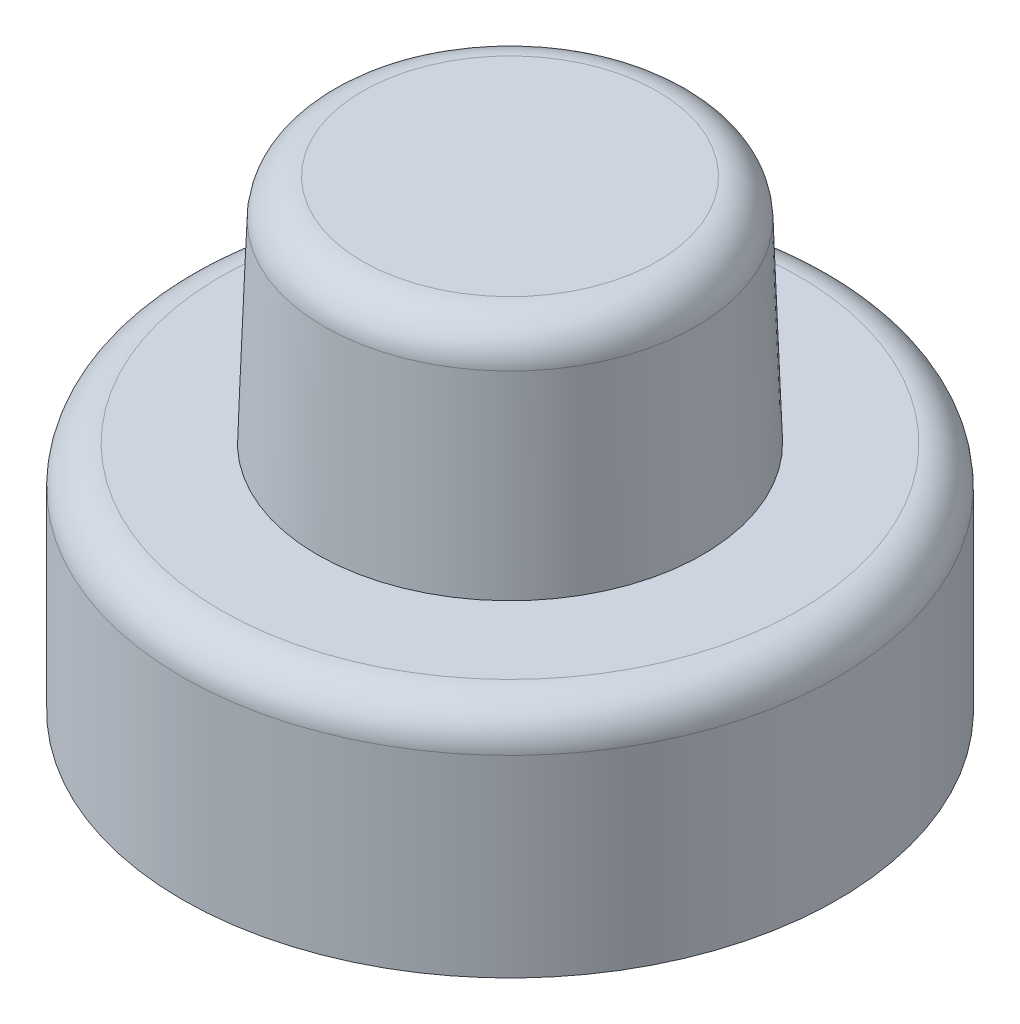
ISO-10303-21;
HEADER;
FILE_DESCRIPTION(('STEP AP214'),'2;1');
FILE_NAME('part.step','',(''),(''),'','','');
FILE_SCHEMA(('AUTOMOTIVE_DESIGN { 1 0 10303 214 1 1 1 1 }'));
ENDSEC;
DATA;
#1=APPLICATION_CONTEXT('core data for automotive mechanical design processes');
#2=APPLICATION_PROTOCOL_DEFINITION('international standard','automotive_design',2000,#1);
#3=PRODUCT_CONTEXT('',#1,'mechanical');
#4=PRODUCT('Part','Part','',(#3));
#5=PRODUCT_RELATED_PRODUCT_CATEGORY('part','',(#4));
#6=PRODUCT_DEFINITION_FORMATION('','',#4);
#7=PRODUCT_DEFINITION_CONTEXT('part definition',#1,'design');
#8=PRODUCT_DEFINITION('design','',#6,#7);
#9=PRODUCT_DEFINITION_SHAPE('','',#8);
#10=(LENGTH_UNIT() NAMED_UNIT(*) SI_UNIT(.MILLI.,.METRE.));
#11=(NAMED_UNIT(*) PLANE_ANGLE_UNIT() SI_UNIT($,.RADIAN.));
#12=(NAMED_UNIT(*) SI_UNIT($,.STERADIAN.) SOLID_ANGLE_UNIT());
#13=UNCERTAINTY_MEASURE_WITH_UNIT(LENGTH_MEASURE(1.E-05),#10,'distance_accuracy_value','');
#14=(GEOMETRIC_REPRESENTATION_CONTEXT(3) GLOBAL_UNCERTAINTY_ASSIGNED_CONTEXT((#13)) GLOBAL_UNIT_ASSIGNED_CONTEXT((#10,
#11,#12)) REPRESENTATION_CONTEXT('',''));
#15=CARTESIAN_POINT('',(0.,0.,0.));
#16=DIRECTION('',(0.,0.,1.));
#17=DIRECTION('',(1.,0.,0.));
#18=AXIS2_PLACEMENT_3D('',#15,#16,#17);
#19=CARTESIAN_POINT('',(-51.1201704164734,6.,0.));
#20=DIRECTION('',(0.,-1.,0.));
#21=DIRECTION('',(0.,0.,-1.));
#22=AXIS2_PLACEMENT_3D('',#19,#20,#21);
#23=CYLINDRICAL_SURFACE('',#22,8.5);
#24=CARTESIAN_POINT('',(-51.1201704164734,5.,0.));
#25=DIRECTION('',(0.,1.,0.));
#26=DIRECTION('',(0.,0.,1.));
#27=AXIS2_PLACEMENT_3D('',#24,#25,#26);
#28=CIRCLE('',#27,8.5);
#29=CARTESIAN_POINT('',(-51.1201704164734,5.,8.5));
#30=VERTEX_POINT('',#29);
#31=EDGE_CURVE('E50',#30,#30,#28,.F.);
#32=ORIENTED_EDGE('',*,*,#31,.T.);
#33=EDGE_LOOP('',(#32));
#34=FACE_BOUND('',#33,.T.);
#35=CARTESIAN_POINT('',(-51.1201704164734,0.,0.));
#36=DIRECTION('',(0.,1.,0.));
#37=DIRECTION('',(0.,0.,1.));
#38=AXIS2_PLACEMENT_3D('',#35,#36,#37);
#39=CIRCLE('',#38,8.5);
#40=CARTESIAN_POINT('',(-51.1201704164734,0.,8.5));
#41=VERTEX_POINT('',#40);
#42=EDGE_CURVE('E61',#41,#41,#39,.T.);
#43=ORIENTED_EDGE('',*,*,#42,.T.);
#44=EDGE_LOOP('',(#43));
#45=FACE_BOUND('',#44,.T.);
#46=ADVANCED_FACE('F37',(#34,#45),#23,.T.);
#47=CARTESIAN_POINT('',(-51.1201704164734,6.,0.));
#48=DIRECTION('',(0.,1.,0.));
#49=DIRECTION('',(0.,0.,1.));
#50=AXIS2_PLACEMENT_3D('',#47,#48,#49);
#51=PLANE('',#50);
#52=CARTESIAN_POINT('',(-51.1201704164734,6.,0.));
#53=DIRECTION('',(0.,1.,0.));
#54=DIRECTION('',(0.,0.,1.));
#55=AXIS2_PLACEMENT_3D('',#52,#53,#54);
#56=CIRCLE('',#55,5.);
#57=CARTESIAN_POINT('',(-51.1201704164734,6.,5.));
#58=VERTEX_POINT('',#57);
#59=EDGE_CURVE('E65',#58,#58,#56,.T.);
#60=ORIENTED_EDGE('',*,*,#59,.F.);
#61=EDGE_LOOP('',(#60));
#62=FACE_BOUND('',#61,.T.);
#63=CARTESIAN_POINT('',(-51.1201704164734,6.,0.));
#64=DIRECTION('',(0.,1.,0.));
#65=DIRECTION('',(0.,0.,1.));
#66=AXIS2_PLACEMENT_3D('',#63,#64,#65);
#67=CIRCLE('',#66,7.5);
#68=CARTESIAN_POINT('',(-51.1201704164734,6.,7.5));
#69=VERTEX_POINT('',#68);
#70=EDGE_CURVE('E55',#69,#69,#67,.T.);
#71=ORIENTED_EDGE('',*,*,#70,.T.);
#72=EDGE_LOOP('',(#71));
#73=FACE_BOUND('',#72,.T.);
#74=ADVANCED_FACE('F72',(#62,#73),#51,.T.);
#75=CARTESIAN_POINT('',(-51.1201704164734,0.,0.));
#76=DIRECTION('',(0.,1.,0.));
#77=DIRECTION('',(0.,0.,1.));
#78=AXIS2_PLACEMENT_3D('',#75,#76,#77);
#79=PLANE('',#78);
#80=ORIENTED_EDGE('',*,*,#42,.F.);
#81=EDGE_LOOP('',(#80));
#82=FACE_BOUND('',#81,.T.);
#83=ADVANCED_FACE('F75',(#82),#79,.F.);
#84=CARTESIAN_POINT('',(-51.1201704164734,5.,0.));
#85=DIRECTION('',(0.,1.,0.));
#86=DIRECTION('',(0.,0.,1.));
#87=AXIS2_PLACEMENT_3D('',#84,#85,#86);
#88=TOROIDAL_SURFACE('',#87,7.5,1.);
#89=ORIENTED_EDGE('',*,*,#31,.F.);
#90=EDGE_LOOP('',(#89));
#91=FACE_BOUND('',#90,.T.);
#92=ORIENTED_EDGE('',*,*,#70,.F.);
#93=EDGE_LOOP('',(#92));
#94=FACE_BOUND('',#93,.T.);
#95=ADVANCED_FACE('F79',(#91,#94),#88,.T.);
#96=CARTESIAN_POINT('',(-51.1201704164734,6.,0.));
#97=DIRECTION('',(0.,-1.,0.));
#98=DIRECTION('',(0.,0.,1.));
#99=AXIS2_PLACEMENT_3D('',#96,#97,#98);
#100=CONICAL_SURFACE('',#99,5.,0.0349065850398866);
#101=CARTESIAN_POINT('',(-51.1201704164734,11.0348994967025,0.));
#102=DIRECTION('',(0.,-1.,0.));
#103=DIRECTION('',(0.,0.,-1.));
#104=AXIS2_PLACEMENT_3D('',#101,#102,#103);
#105=CIRCLE('',#104,4.82417743526153);
#106=CARTESIAN_POINT('',(-51.1201704164734,11.0348994967025,-4.82417743526153));
#107=VERTEX_POINT('',#106);
#108=EDGE_CURVE('E10',#107,#107,#105,.T.);
#109=ORIENTED_EDGE('',*,*,#108,.T.);
#110=EDGE_LOOP('',(#109));
#111=FACE_BOUND('',#110,.T.);
#112=ORIENTED_EDGE('',*,*,#59,.T.);
#113=EDGE_LOOP('',(#112));
#114=FACE_BOUND('',#113,.T.);
#115=ADVANCED_FACE('F70',(#111,#114),#100,.T.);
#116=CARTESIAN_POINT('',(-51.1201704164734,12.,0.));
#117=DIRECTION('',(0.,1.,0.));
#118=DIRECTION('',(0.,0.,1.));
#119=AXIS2_PLACEMENT_3D('',#116,#117,#118);
#120=PLANE('',#119);
#121=CARTESIAN_POINT('',(-51.1201704164734,12.,0.));
#122=DIRECTION('',(0.,1.,0.));
#123=DIRECTION('',(0.,0.,1.));
#124=AXIS2_PLACEMENT_3D('',#121,#122,#123);
#125=CIRCLE('',#124,3.82478660824244);
#126=CARTESIAN_POINT('',(-51.1201704164734,12.,3.82478660824244));
#127=VERTEX_POINT('',#126);
#128=EDGE_CURVE('E45',#127,#127,#125,.T.);
#129=ORIENTED_EDGE('',*,*,#128,.T.);
#130=EDGE_LOOP('',(#129));
#131=FACE_BOUND('',#130,.T.);
#132=ADVANCED_FACE('F86',(#131),#120,.T.);
#133=CARTESIAN_POINT('',(-51.1201704164734,11.,0.));
#134=DIRECTION('',(0.,1.,0.));
#135=DIRECTION('',(0.,0.,1.));
#136=AXIS2_PLACEMENT_3D('',#133,#134,#135);
#137=TOROIDAL_SURFACE('',#136,3.82478660824244,1.);
#138=ORIENTED_EDGE('',*,*,#108,.F.);
#139=EDGE_LOOP('',(#138));
#140=FACE_BOUND('',#139,.T.);
#141=ORIENTED_EDGE('',*,*,#128,.F.);
#142=EDGE_LOOP('',(#141));
#143=FACE_BOUND('',#142,.T.);
#144=ADVANCED_FACE('F39',(#140,#143),#137,.T.);
#145=CLOSED_SHELL('',(#46,#74,#83,#95,#115,#132,#144));
#146=MANIFOLD_SOLID_BREP('B2',#145);
#147=ADVANCED_BREP_SHAPE_REPRESENTATION('',(#18,#146),#14);
#148=SHAPE_DEFINITION_REPRESENTATION(#9,#147);
ENDSEC;
END-ISO-10303-21;
